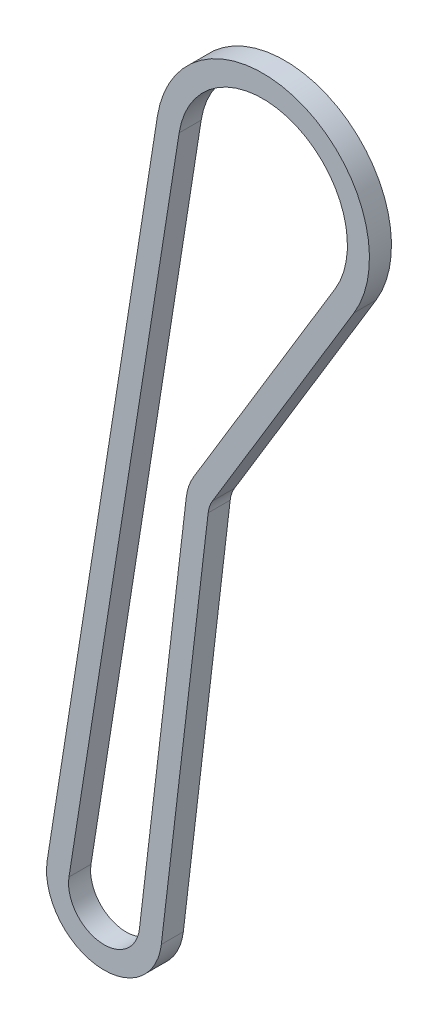
ISO-10303-21;
HEADER;
FILE_DESCRIPTION(('STEP AP214'),'2;1');
FILE_NAME('part.step','',(''),(''),'','','');
FILE_SCHEMA(('AUTOMOTIVE_DESIGN { 1 0 10303 214 1 1 1 1 }'));
ENDSEC;
DATA;
#1=APPLICATION_CONTEXT('core data for automotive mechanical design processes');
#2=APPLICATION_PROTOCOL_DEFINITION('international standard','automotive_design',2000,#1);
#3=PRODUCT_CONTEXT('',#1,'mechanical');
#4=PRODUCT('Part','Part','',(#3));
#5=PRODUCT_RELATED_PRODUCT_CATEGORY('part','',(#4));
#6=PRODUCT_DEFINITION_FORMATION('','',#4);
#7=PRODUCT_DEFINITION_CONTEXT('part definition',#1,'design');
#8=PRODUCT_DEFINITION('design','',#6,#7);
#9=PRODUCT_DEFINITION_SHAPE('','',#8);
#10=(LENGTH_UNIT() NAMED_UNIT(*) SI_UNIT(.MILLI.,.METRE.));
#11=(NAMED_UNIT(*) PLANE_ANGLE_UNIT() SI_UNIT($,.RADIAN.));
#12=(NAMED_UNIT(*) SI_UNIT($,.STERADIAN.) SOLID_ANGLE_UNIT());
#13=UNCERTAINTY_MEASURE_WITH_UNIT(LENGTH_MEASURE(1.E-05),#10,'distance_accuracy_value','');
#14=(GEOMETRIC_REPRESENTATION_CONTEXT(3) GLOBAL_UNCERTAINTY_ASSIGNED_CONTEXT((#13)) GLOBAL_UNIT_ASSIGNED_CONTEXT((#10,
#11,#12)) REPRESENTATION_CONTEXT('',''));
#15=CARTESIAN_POINT('',(0.,0.,0.));
#16=DIRECTION('',(0.,0.,1.));
#17=DIRECTION('',(1.,0.,0.));
#18=AXIS2_PLACEMENT_3D('',#15,#16,#17);
#19=CARTESIAN_POINT('',(-8.72368290669479,-5.96843836723152,-5.));
#20=DIRECTION('',(0.,0.,1.));
#21=DIRECTION('',(1.,0.,0.));
#22=AXIS2_PLACEMENT_3D('',#19,#20,#21);
#23=CYLINDRICAL_SURFACE('',#22,13.07);
#24=CARTESIAN_POINT('',(-8.72368290669479,-5.96843836723152,0.));
#25=DIRECTION('',(0.,0.,1.));
#26=DIRECTION('',(-1.,0.,0.));
#27=AXIS2_PLACEMENT_3D('',#24,#25,#26);
#28=CIRCLE('',#27,13.07);
#29=CARTESIAN_POINT('',(-21.6345893268788,-3.9353630097371,0.));
#30=VERTEX_POINT('',#29);
#31=CARTESIAN_POINT('',(4.25635018692678,-7.49933382038595,0.));
#32=VERTEX_POINT('',#31);
#33=EDGE_CURVE('E209',#30,#32,#28,.T.);
#34=ORIENTED_EDGE('',*,*,#33,.F.);
#35=DIRECTION('',(0.,0.,1.));
#36=VECTOR('',#35,1.);
#37=CARTESIAN_POINT('',(-21.6345893268788,-3.9353630097371,-5.));
#38=LINE('',#37,#36);
#39=CARTESIAN_POINT('',(-21.6345893268788,-3.9353630097371,-5.));
#40=VERTEX_POINT('',#39);
#41=EDGE_CURVE('E12',#40,#30,#38,.T.);
#42=ORIENTED_EDGE('',*,*,#41,.F.);
#43=CARTESIAN_POINT('',(-8.72368290669479,-5.96843836723152,-5.));
#44=DIRECTION('',(0.,0.,1.));
#45=DIRECTION('',(-1.,0.,0.));
#46=AXIS2_PLACEMENT_3D('',#43,#44,#45);
#47=CIRCLE('',#46,13.07);
#48=CARTESIAN_POINT('',(4.25635018692678,-7.49933382038595,-5.));
#49=VERTEX_POINT('',#48);
#50=EDGE_CURVE('E217',#40,#49,#47,.T.);
#51=ORIENTED_EDGE('',*,*,#50,.T.);
#52=DIRECTION('',(0.,0.,1.));
#53=VECTOR('',#52,1.);
#54=CARTESIAN_POINT('',(4.25635018692678,-7.49933382038595,-5.));
#55=LINE('',#54,#53);
#56=EDGE_CURVE('E78',#49,#32,#55,.T.);
#57=ORIENTED_EDGE('',*,*,#56,.T.);
#58=EDGE_LOOP('',(#34,#42,#51,#57));
#59=FACE_BOUND('',#58,.T.);
#60=ADVANCED_FACE('F75',(#59),#23,.T.);
#61=CARTESIAN_POINT('',(-21.6345893268788,-3.9353630097371,-5.));
#62=DIRECTION('',(-0.987827576142618,0.155552820007224,0.));
#63=DIRECTION('',(-0.155552820007224,-0.987827576142618,0.));
#64=AXIS2_PLACEMENT_3D('',#61,#62,#63);
#65=PLANE('',#64);
#66=DIRECTION('',(-0.155552820007224,-0.987827576142618,0.));
#67=VECTOR('',#66,1.);
#68=CARTESIAN_POINT('',(-21.6345893268788,-3.9353630097371,0.));
#69=LINE('',#68,#67);
#70=CARTESIAN_POINT('',(3.36101147489236,154.797495405144,0.));
#71=VERTEX_POINT('',#70);
#72=EDGE_CURVE('E221',#71,#30,#69,.T.);
#73=ORIENTED_EDGE('',*,*,#72,.F.);
#74=DIRECTION('',(0.,0.,1.));
#75=VECTOR('',#74,1.);
#76=CARTESIAN_POINT('',(3.36101147489236,154.797495405144,-5.));
#77=LINE('',#76,#75);
#78=CARTESIAN_POINT('',(3.36101147489236,154.797495405144,-5.));
#79=VERTEX_POINT('',#78);
#80=EDGE_CURVE('E83',#79,#71,#77,.T.);
#81=ORIENTED_EDGE('',*,*,#80,.F.);
#82=DIRECTION('',(-0.155552820007224,-0.987827576142618,0.));
#83=VECTOR('',#82,1.);
#84=CARTESIAN_POINT('',(-21.6345893268788,-3.9353630097371,-5.));
#85=LINE('',#84,#83);
#86=EDGE_CURVE('E233',#79,#40,#85,.T.);
#87=ORIENTED_EDGE('',*,*,#86,.T.);
#88=ORIENTED_EDGE('',*,*,#41,.T.);
#89=EDGE_LOOP('',(#73,#81,#87,#88));
#90=FACE_BOUND('',#89,.T.);
#91=ADVANCED_FACE('F270',(#90),#65,.T.);
#92=CARTESIAN_POINT('',(27.2763170933051,151.031561632769,-5.));
#93=DIRECTION('',(0.,0.,1.));
#94=DIRECTION('',(1.,0.,0.));
#95=AXIS2_PLACEMENT_3D('',#92,#93,#94);
#96=CYLINDRICAL_SURFACE('',#95,24.21);
#97=CARTESIAN_POINT('',(27.2763170933051,151.031561632769,0.));
#98=DIRECTION('',(0.,0.,1.));
#99=DIRECTION('',(-1.,0.,0.));
#100=AXIS2_PLACEMENT_3D('',#97,#98,#99);
#101=CIRCLE('',#100,24.21);
#102=CARTESIAN_POINT('',(47.9835762422017,138.488295768551,0.));
#103=VERTEX_POINT('',#102);
#104=EDGE_CURVE('E247',#103,#71,#101,.T.);
#105=ORIENTED_EDGE('',*,*,#104,.F.);
#106=DIRECTION('',(0.,0.,1.));
#107=VECTOR('',#106,1.);
#108=CARTESIAN_POINT('',(47.9835762422017,138.488295768551,-5.));
#109=LINE('',#108,#107);
#110=CARTESIAN_POINT('',(47.9835762422017,138.488295768551,-5.));
#111=VERTEX_POINT('',#110);
#112=EDGE_CURVE('E253',#111,#103,#109,.T.);
#113=ORIENTED_EDGE('',*,*,#112,.F.);
#114=CARTESIAN_POINT('',(27.2763170933051,151.031561632769,-5.));
#115=DIRECTION('',(0.,0.,1.));
#116=DIRECTION('',(-1.,0.,0.));
#117=AXIS2_PLACEMENT_3D('',#114,#115,#116);
#118=CIRCLE('',#117,24.21);
#119=EDGE_CURVE('E230',#111,#79,#118,.T.);
#120=ORIENTED_EDGE('',*,*,#119,.T.);
#121=ORIENTED_EDGE('',*,*,#80,.T.);
#122=EDGE_LOOP('',(#105,#113,#120,#121));
#123=FACE_BOUND('',#122,.T.);
#124=ADVANCED_FACE('F281',(#123),#96,.T.);
#125=CARTESIAN_POINT('',(47.9835762422017,138.488295768551,-5.));
#126=DIRECTION('',(0.855318428289822,-0.518102679232436,0.));
#127=DIRECTION('',(0.518102679232436,0.855318428289822,0.));
#128=AXIS2_PLACEMENT_3D('',#125,#126,#127);
#129=PLANE('',#128);
#130=DIRECTION('',(0.518102679232436,0.855318428289822,0.));
#131=VECTOR('',#130,1.);
#132=CARTESIAN_POINT('',(47.9835762422017,138.488295768551,0.));
#133=LINE('',#132,#131);
#134=CARTESIAN_POINT('',(15.8517181306517,85.4428831898743,0.));
#135=VERTEX_POINT('',#134);
#136=EDGE_CURVE('E244',#135,#103,#133,.T.);
#137=ORIENTED_EDGE('',*,*,#136,.F.);
#138=DIRECTION('',(0.,0.,1.));
#139=VECTOR('',#138,1.);
#140=CARTESIAN_POINT('',(15.8517181306517,85.4428831898743,-5.));
#141=LINE('',#140,#139);
#142=CARTESIAN_POINT('',(15.8517181306517,85.4428831898743,-5.));
#143=VERTEX_POINT('',#142);
#144=EDGE_CURVE('E255',#143,#135,#141,.T.);
#145=ORIENTED_EDGE('',*,*,#144,.F.);
#146=DIRECTION('',(0.518102679232436,0.855318428289822,0.));
#147=VECTOR('',#146,1.);
#148=CARTESIAN_POINT('',(47.9835762422017,138.488295768551,-5.));
#149=LINE('',#148,#147);
#150=EDGE_CURVE('E227',#143,#111,#149,.T.);
#151=ORIENTED_EDGE('',*,*,#150,.T.);
#152=ORIENTED_EDGE('',*,*,#112,.T.);
#153=EDGE_LOOP('',(#137,#145,#151,#152));
#154=FACE_BOUND('',#153,.T.);
#155=ADVANCED_FACE('F279',(#154),#129,.T.);
#156=CARTESIAN_POINT('',(21.8389471286804,81.8161644352472,-5.));
#157=DIRECTION('',(0.,0.,1.));
#158=DIRECTION('',(1.,0.,0.));
#159=AXIS2_PLACEMENT_3D('',#156,#157,#158);
#160=CYLINDRICAL_SURFACE('',#159,7.);
#161=CARTESIAN_POINT('',(21.8389471286804,81.8161644352472,0.));
#162=DIRECTION('',(0.,0.,-1.));
#163=DIRECTION('',(1.,0.,0.));
#164=AXIS2_PLACEMENT_3D('',#161,#162,#163);
#165=CIRCLE('',#164,7.);
#166=CARTESIAN_POINT('',(14.8871313937645,82.6360778378548,0.));
#167=VERTEX_POINT('',#166);
#168=EDGE_CURVE('E241',#167,#135,#165,.T.);
#169=ORIENTED_EDGE('',*,*,#168,.F.);
#170=DIRECTION('',(0.,0.,1.));
#171=VECTOR('',#170,1.);
#172=CARTESIAN_POINT('',(14.8871313937645,82.6360778378548,-5.));
#173=LINE('',#172,#171);
#174=CARTESIAN_POINT('',(14.8871313937645,82.6360778378548,-5.));
#175=VERTEX_POINT('',#174);
#176=EDGE_CURVE('E256',#175,#167,#173,.T.);
#177=ORIENTED_EDGE('',*,*,#176,.F.);
#178=CARTESIAN_POINT('',(21.8389471286804,81.8161644352472,-5.));
#179=DIRECTION('',(0.,0.,-1.));
#180=DIRECTION('',(1.,0.,0.));
#181=AXIS2_PLACEMENT_3D('',#178,#179,#180);
#182=CIRCLE('',#181,7.);
#183=EDGE_CURVE('E224',#175,#143,#182,.T.);
#184=ORIENTED_EDGE('',*,*,#183,.T.);
#185=ORIENTED_EDGE('',*,*,#144,.T.);
#186=EDGE_LOOP('',(#169,#177,#184,#185));
#187=FACE_BOUND('',#186,.T.);
#188=ADVANCED_FACE('F276',(#187),#160,.F.);
#189=CARTESIAN_POINT('',(14.8871313937645,82.6360778378548,-5.));
#190=DIRECTION('',(0.993116533559416,-0.117130486086797,0.));
#191=DIRECTION('',(0.117130486086797,0.993116533559416,0.));
#192=AXIS2_PLACEMENT_3D('',#189,#190,#191);
#193=PLANE('',#192);
#194=DIRECTION('',(0.117130486086797,0.993116533559416,0.));
#195=VECTOR('',#194,1.);
#196=CARTESIAN_POINT('',(14.8871313937645,82.6360778378548,0.));
#197=LINE('',#196,#195);
#198=EDGE_CURVE('E238',#32,#167,#197,.T.);
#199=ORIENTED_EDGE('',*,*,#198,.F.);
#200=ORIENTED_EDGE('',*,*,#56,.F.);
#201=DIRECTION('',(0.117130486086797,0.993116533559416,0.));
#202=VECTOR('',#201,1.);
#203=CARTESIAN_POINT('',(14.8871313937645,82.6360778378548,-5.));
#204=LINE('',#203,#202);
#205=EDGE_CURVE('E220',#49,#175,#204,.T.);
#206=ORIENTED_EDGE('',*,*,#205,.T.);
#207=ORIENTED_EDGE('',*,*,#176,.T.);
#208=EDGE_LOOP('',(#199,#200,#206,#207));
#209=FACE_BOUND('',#208,.T.);
#210=ADVANCED_FACE('F264',(#209),#193,.T.);
#211=CARTESIAN_POINT('',(-8.72368290669479,-5.96843836723152,-5.));
#212=DIRECTION('',(0.,0.,1.));
#213=DIRECTION('',(1.,0.,0.));
#214=AXIS2_PLACEMENT_3D('',#211,#212,#213);
#215=PLANE('',#214);
#216=DIRECTION('',(-0.155552820007224,-0.987827576142618,0.));
#217=VECTOR('',#216,1.);
#218=CARTESIAN_POINT('',(-16.6954514461657,-4.71312710977322,-5.));
#219=LINE('',#218,#217);
#220=CARTESIAN_POINT('',(8.30014935560545,154.019731305108,-5.));
#221=VERTEX_POINT('',#220);
#222=CARTESIAN_POINT('',(-16.6954514461657,-4.71312710977322,-5.00000000000001));
#223=VERTEX_POINT('',#222);
#224=EDGE_CURVE('E172',#221,#223,#219,.T.);
#225=ORIENTED_EDGE('',*,*,#224,.T.);
#226=CARTESIAN_POINT('',(-8.72368290669479,-5.96843836723152,-5.));
#227=DIRECTION('',(0.,0.,-1.));
#228=DIRECTION('',(-1.,0.,0.));
#229=AXIS2_PLACEMENT_3D('',#226,#227,#228);
#230=CIRCLE('',#229,8.07);
#231=CARTESIAN_POINT('',(-0.709232480870296,-6.91368138995196,-5.00000000000001));
#232=VERTEX_POINT('',#231);
#233=EDGE_CURVE('E166',#223,#232,#230,.F.);
#234=ORIENTED_EDGE('',*,*,#233,.T.);
#235=DIRECTION('',(0.117130486086797,0.993116533559416,0.));
#236=VECTOR('',#235,1.);
#237=CARTESIAN_POINT('',(-0.709232480870299,-6.91368138995196,-5.));
#238=LINE('',#237,#236);
#239=CARTESIAN_POINT('',(9.92154872596742,83.2217302682888,-5.));
#240=VERTEX_POINT('',#239);
#241=EDGE_CURVE('E175',#232,#240,#238,.T.);
#242=ORIENTED_EDGE('',*,*,#241,.T.);
#243=CARTESIAN_POINT('',(21.8389471286804,81.8161644352472,-5.));
#244=DIRECTION('',(0.,0.,-1.));
#245=DIRECTION('',(-1.,0.,0.));
#246=AXIS2_PLACEMENT_3D('',#243,#244,#245);
#247=CIRCLE('',#246,12.);
#248=CARTESIAN_POINT('',(11.5751259892025,88.0333965860365,-5.));
#249=VERTEX_POINT('',#248);
#250=EDGE_CURVE('E91',#240,#249,#247,.T.);
#251=ORIENTED_EDGE('',*,*,#250,.T.);
#252=DIRECTION('',(0.518102679232436,0.855318428289822,0.));
#253=VECTOR('',#252,1.);
#254=CARTESIAN_POINT('',(-35.529924582581,10.2692401079045,-5.));
#255=LINE('',#254,#253);
#256=CARTESIAN_POINT('',(43.7069841007526,141.078809164714,-5.));
#257=VERTEX_POINT('',#256);
#258=EDGE_CURVE('E190',#249,#257,#255,.T.);
#259=ORIENTED_EDGE('',*,*,#258,.T.);
#260=CARTESIAN_POINT('',(27.2763170933051,151.031561632769,-5.));
#261=DIRECTION('',(0.,0.,-1.));
#262=DIRECTION('',(-1.,0.,0.));
#263=AXIS2_PLACEMENT_3D('',#260,#261,#262);
#264=CIRCLE('',#263,19.21);
#265=EDGE_CURVE('E193',#257,#221,#264,.F.);
#266=ORIENTED_EDGE('',*,*,#265,.T.);
#267=EDGE_LOOP('',(#225,#234,#242,#251,#259,#266));
#268=FACE_BOUND('',#267,.T.);
#269=ORIENTED_EDGE('',*,*,#50,.F.);
#270=ORIENTED_EDGE('',*,*,#86,.F.);
#271=ORIENTED_EDGE('',*,*,#119,.F.);
#272=ORIENTED_EDGE('',*,*,#150,.F.);
#273=ORIENTED_EDGE('',*,*,#183,.F.);
#274=ORIENTED_EDGE('',*,*,#205,.F.);
#275=EDGE_LOOP('',(#269,#270,#271,#272,#273,#274));
#276=FACE_BOUND('',#275,.T.);
#277=ADVANCED_FACE('F179',(#268,#276),#215,.F.);
#278=CARTESIAN_POINT('',(-8.72368290669479,-5.96843836723152,0.));
#279=DIRECTION('',(0.,0.,1.));
#280=DIRECTION('',(1.,0.,0.));
#281=AXIS2_PLACEMENT_3D('',#278,#279,#280);
#282=PLANE('',#281);
#283=CARTESIAN_POINT('',(-8.72368290669479,-5.96843836723152,0.));
#284=DIRECTION('',(0.,0.,-1.));
#285=DIRECTION('',(-1.,0.,0.));
#286=AXIS2_PLACEMENT_3D('',#283,#284,#285);
#287=CIRCLE('',#286,8.07);
#288=CARTESIAN_POINT('',(-16.6954514461657,-4.71312710977322,0.));
#289=VERTEX_POINT('',#288);
#290=CARTESIAN_POINT('',(-0.709232480870301,-6.91368138995196,0.));
#291=VERTEX_POINT('',#290);
#292=EDGE_CURVE('E99',#289,#291,#287,.F.);
#293=ORIENTED_EDGE('',*,*,#292,.F.);
#294=DIRECTION('',(-0.155552820007224,-0.987827576142618,0.));
#295=VECTOR('',#294,1.);
#296=CARTESIAN_POINT('',(-16.6954514461657,-4.71312710977322,0.));
#297=LINE('',#296,#295);
#298=CARTESIAN_POINT('',(8.30014935560545,154.019731305108,0.));
#299=VERTEX_POINT('',#298);
#300=EDGE_CURVE('E183',#299,#289,#297,.T.);
#301=ORIENTED_EDGE('',*,*,#300,.F.);
#302=CARTESIAN_POINT('',(27.2763170933051,151.031561632769,0.));
#303=DIRECTION('',(0.,0.,-1.));
#304=DIRECTION('',(-1.,0.,0.));
#305=AXIS2_PLACEMENT_3D('',#302,#303,#304);
#306=CIRCLE('',#305,19.21);
#307=CARTESIAN_POINT('',(43.7069841007526,141.078809164714,0.));
#308=VERTEX_POINT('',#307);
#309=EDGE_CURVE('E186',#308,#299,#306,.F.);
#310=ORIENTED_EDGE('',*,*,#309,.F.);
#311=DIRECTION('',(0.518102679232436,0.855318428289822,0.));
#312=VECTOR('',#311,1.);
#313=CARTESIAN_POINT('',(-35.529924582581,10.2692401079045,0.));
#314=LINE('',#313,#312);
#315=CARTESIAN_POINT('',(11.5751259892025,88.0333965860365,0.));
#316=VERTEX_POINT('',#315);
#317=EDGE_CURVE('E202',#316,#308,#314,.T.);
#318=ORIENTED_EDGE('',*,*,#317,.F.);
#319=CARTESIAN_POINT('',(21.8389471286804,81.8161644352472,0.));
#320=DIRECTION('',(0.,0.,-1.));
#321=DIRECTION('',(-1.,0.,0.));
#322=AXIS2_PLACEMENT_3D('',#319,#320,#321);
#323=CIRCLE('',#322,12.);
#324=CARTESIAN_POINT('',(9.92154872596742,83.2217302682888,0.));
#325=VERTEX_POINT('',#324);
#326=EDGE_CURVE('E199',#325,#316,#323,.T.);
#327=ORIENTED_EDGE('',*,*,#326,.F.);
#328=DIRECTION('',(0.117130486086797,0.993116533559416,0.));
#329=VECTOR('',#328,1.);
#330=CARTESIAN_POINT('',(-0.709232480870299,-6.91368138995196,0.));
#331=LINE('',#330,#329);
#332=EDGE_CURVE('E197',#291,#325,#331,.T.);
#333=ORIENTED_EDGE('',*,*,#332,.F.);
#334=EDGE_LOOP('',(#293,#301,#310,#318,#327,#333));
#335=FACE_BOUND('',#334,.T.);
#336=ORIENTED_EDGE('',*,*,#33,.T.);
#337=ORIENTED_EDGE('',*,*,#198,.T.);
#338=ORIENTED_EDGE('',*,*,#168,.T.);
#339=ORIENTED_EDGE('',*,*,#136,.T.);
#340=ORIENTED_EDGE('',*,*,#104,.T.);
#341=ORIENTED_EDGE('',*,*,#72,.T.);
#342=EDGE_LOOP('',(#336,#337,#338,#339,#340,#341));
#343=FACE_BOUND('',#342,.T.);
#344=ADVANCED_FACE('F266',(#335,#343),#282,.T.);
#345=CARTESIAN_POINT('',(-8.72368290669479,-5.96843836723152,-5.));
#346=DIRECTION('',(0.,0.,1.));
#347=DIRECTION('',(1.,0.,0.));
#348=AXIS2_PLACEMENT_3D('',#345,#346,#347);
#349=CYLINDRICAL_SURFACE('',#348,8.07);
#350=ORIENTED_EDGE('',*,*,#292,.T.);
#351=DIRECTION('',(0.,0.,1.));
#352=VECTOR('',#351,1.);
#353=CARTESIAN_POINT('',(-0.709232480870296,-6.91368138995196,-5.00000000000001));
#354=LINE('',#353,#352);
#355=EDGE_CURVE('E162',#232,#291,#354,.T.);
#356=ORIENTED_EDGE('',*,*,#355,.F.);
#357=ORIENTED_EDGE('',*,*,#233,.F.);
#358=DIRECTION('',(0.,0.,1.));
#359=VECTOR('',#358,1.);
#360=CARTESIAN_POINT('',(-16.6954514461657,-4.71312710977322,-5.00000000000001));
#361=LINE('',#360,#359);
#362=EDGE_CURVE('E207',#223,#289,#361,.T.);
#363=ORIENTED_EDGE('',*,*,#362,.T.);
#364=EDGE_LOOP('',(#350,#356,#357,#363));
#365=FACE_BOUND('',#364,.T.);
#366=ADVANCED_FACE('F164',(#365),#349,.F.);
#367=CARTESIAN_POINT('',(-16.6954514461657,-4.71312710977322,-5.));
#368=DIRECTION('',(-0.987827576142618,0.155552820007224,0.));
#369=DIRECTION('',(-0.155552820007224,-0.987827576142618,0.));
#370=AXIS2_PLACEMENT_3D('',#367,#368,#369);
#371=PLANE('',#370);
#372=ORIENTED_EDGE('',*,*,#300,.T.);
#373=ORIENTED_EDGE('',*,*,#362,.F.);
#374=ORIENTED_EDGE('',*,*,#224,.F.);
#375=DIRECTION('',(0.,0.,1.));
#376=VECTOR('',#375,1.);
#377=CARTESIAN_POINT('',(8.30014935560545,154.019731305108,-5.));
#378=LINE('',#377,#376);
#379=EDGE_CURVE('E210',#221,#299,#378,.T.);
#380=ORIENTED_EDGE('',*,*,#379,.T.);
#381=EDGE_LOOP('',(#372,#373,#374,#380));
#382=FACE_BOUND('',#381,.T.);
#383=ADVANCED_FACE('F350',(#382),#371,.F.);
#384=CARTESIAN_POINT('',(27.2763170933051,151.031561632769,-5.));
#385=DIRECTION('',(0.,0.,1.));
#386=DIRECTION('',(1.,0.,0.));
#387=AXIS2_PLACEMENT_3D('',#384,#385,#386);
#388=CYLINDRICAL_SURFACE('',#387,19.21);
#389=ORIENTED_EDGE('',*,*,#309,.T.);
#390=ORIENTED_EDGE('',*,*,#379,.F.);
#391=ORIENTED_EDGE('',*,*,#265,.F.);
#392=DIRECTION('',(0.,0.,1.));
#393=VECTOR('',#392,1.);
#394=CARTESIAN_POINT('',(43.7069841007526,141.078809164714,-5.));
#395=LINE('',#394,#393);
#396=EDGE_CURVE('E212',#257,#308,#395,.T.);
#397=ORIENTED_EDGE('',*,*,#396,.T.);
#398=EDGE_LOOP('',(#389,#390,#391,#397));
#399=FACE_BOUND('',#398,.T.);
#400=ADVANCED_FACE('F359',(#399),#388,.F.);
#401=CARTESIAN_POINT('',(-35.529924582581,10.2692401079045,-5.));
#402=DIRECTION('',(0.855318428289822,-0.518102679232436,0.));
#403=DIRECTION('',(0.518102679232436,0.855318428289822,0.));
#404=AXIS2_PLACEMENT_3D('',#401,#402,#403);
#405=PLANE('',#404);
#406=ORIENTED_EDGE('',*,*,#317,.T.);
#407=ORIENTED_EDGE('',*,*,#396,.F.);
#408=ORIENTED_EDGE('',*,*,#258,.F.);
#409=DIRECTION('',(0.,0.,1.));
#410=VECTOR('',#409,1.);
#411=CARTESIAN_POINT('',(11.5751259892025,88.0333965860365,-5.));
#412=LINE('',#411,#410);
#413=EDGE_CURVE('E214',#249,#316,#412,.T.);
#414=ORIENTED_EDGE('',*,*,#413,.T.);
#415=EDGE_LOOP('',(#406,#407,#408,#414));
#416=FACE_BOUND('',#415,.T.);
#417=ADVANCED_FACE('F369',(#416),#405,.F.);
#418=CARTESIAN_POINT('',(21.8389471286804,81.8161644352472,-5.));
#419=DIRECTION('',(0.,0.,1.));
#420=DIRECTION('',(1.,0.,0.));
#421=AXIS2_PLACEMENT_3D('',#418,#419,#420);
#422=CYLINDRICAL_SURFACE('',#421,12.);
#423=ORIENTED_EDGE('',*,*,#326,.T.);
#424=ORIENTED_EDGE('',*,*,#413,.F.);
#425=ORIENTED_EDGE('',*,*,#250,.F.);
#426=DIRECTION('',(0.,0.,1.));
#427=VECTOR('',#426,1.);
#428=CARTESIAN_POINT('',(9.92154872596742,83.2217302682888,-5.00000000000001));
#429=LINE('',#428,#427);
#430=EDGE_CURVE('E171',#240,#325,#429,.T.);
#431=ORIENTED_EDGE('',*,*,#430,.T.);
#432=EDGE_LOOP('',(#423,#424,#425,#431));
#433=FACE_BOUND('',#432,.T.);
#434=ADVANCED_FACE('F379',(#433),#422,.T.);
#435=CARTESIAN_POINT('',(-0.709232480870299,-6.91368138995196,-5.));
#436=DIRECTION('',(0.993116533559416,-0.117130486086797,0.));
#437=DIRECTION('',(0.117130486086797,0.993116533559416,0.));
#438=AXIS2_PLACEMENT_3D('',#435,#436,#437);
#439=PLANE('',#438);
#440=ORIENTED_EDGE('',*,*,#332,.T.);
#441=ORIENTED_EDGE('',*,*,#430,.F.);
#442=ORIENTED_EDGE('',*,*,#241,.F.);
#443=ORIENTED_EDGE('',*,*,#355,.T.);
#444=EDGE_LOOP('',(#440,#441,#442,#443));
#445=FACE_BOUND('',#444,.T.);
#446=ADVANCED_FACE('F176',(#445),#439,.F.);
#447=CLOSED_SHELL('',(#60,#91,#124,#155,#188,#210,#277,#344,#366,#383,#400,#417,#434,#446));
#448=MANIFOLD_SOLID_BREP('B2',#447);
#449=ADVANCED_BREP_SHAPE_REPRESENTATION('',(#18,#448),#14);
#450=SHAPE_DEFINITION_REPRESENTATION(#9,#449);
ENDSEC;
END-ISO-10303-21;
